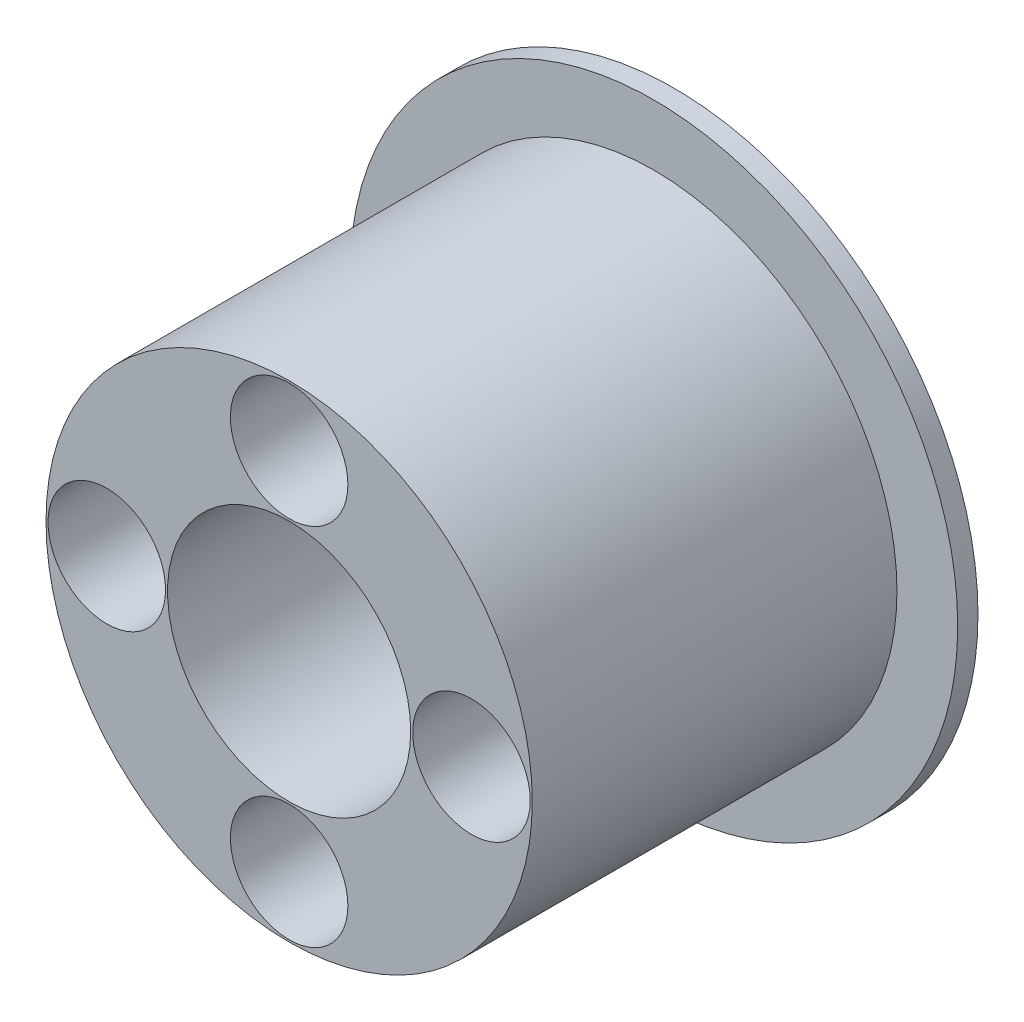
ISO-10303-21;
HEADER;
FILE_DESCRIPTION(('STEP AP214'),'2;1');
FILE_NAME('part.step','',(''),(''),'','','');
FILE_SCHEMA(('AUTOMOTIVE_DESIGN { 1 0 10303 214 1 1 1 1 }'));
ENDSEC;
DATA;
#1=APPLICATION_CONTEXT('core data for automotive mechanical design processes');
#2=APPLICATION_PROTOCOL_DEFINITION('international standard','automotive_design',2000,#1);
#3=PRODUCT_CONTEXT('',#1,'mechanical');
#4=PRODUCT('Part','Part','',(#3));
#5=PRODUCT_RELATED_PRODUCT_CATEGORY('part','',(#4));
#6=PRODUCT_DEFINITION_FORMATION('','',#4);
#7=PRODUCT_DEFINITION_CONTEXT('part definition',#1,'design');
#8=PRODUCT_DEFINITION('design','',#6,#7);
#9=PRODUCT_DEFINITION_SHAPE('','',#8);
#10=(LENGTH_UNIT() NAMED_UNIT(*) SI_UNIT(.MILLI.,.METRE.));
#11=(NAMED_UNIT(*) PLANE_ANGLE_UNIT() SI_UNIT($,.RADIAN.));
#12=(NAMED_UNIT(*) SI_UNIT($,.STERADIAN.) SOLID_ANGLE_UNIT());
#13=UNCERTAINTY_MEASURE_WITH_UNIT(LENGTH_MEASURE(1.E-05),#10,'distance_accuracy_value','');
#14=(GEOMETRIC_REPRESENTATION_CONTEXT(3) GLOBAL_UNCERTAINTY_ASSIGNED_CONTEXT((#13)) GLOBAL_UNIT_ASSIGNED_CONTEXT((#10,
#11,#12)) REPRESENTATION_CONTEXT('',''));
#15=CARTESIAN_POINT('',(0.,0.,0.));
#16=DIRECTION('',(0.,0.,1.));
#17=DIRECTION('',(1.,0.,0.));
#18=AXIS2_PLACEMENT_3D('',#15,#16,#17);
#19=CARTESIAN_POINT('',(0.,0.,18.));
#20=DIRECTION('',(0.,0.,1.));
#21=DIRECTION('',(1.,0.,0.));
#22=AXIS2_PLACEMENT_3D('',#19,#20,#21);
#23=PLANE('',#22);
#24=CARTESIAN_POINT('',(0.,0.,18.));
#25=DIRECTION('',(0.,0.,1.));
#26=DIRECTION('',(1.,0.,0.));
#27=AXIS2_PLACEMENT_3D('',#24,#25,#26);
#28=CIRCLE('',#27,6.);
#29=CARTESIAN_POINT('',(6.,0.,18.));
#30=VERTEX_POINT('',#29);
#31=EDGE_CURVE('E204',#30,#30,#28,.T.);
#32=ORIENTED_EDGE('',*,*,#31,.F.);
#33=EDGE_LOOP('',(#32));
#34=FACE_BOUND('',#33,.T.);
#35=CARTESIAN_POINT('',(0.,9.,18.));
#36=DIRECTION('',(0.,0.,1.));
#37=DIRECTION('',(1.,0.,0.));
#38=AXIS2_PLACEMENT_3D('',#35,#36,#37);
#39=CIRCLE('',#38,2.9);
#40=CARTESIAN_POINT('',(2.90000000000009,9.,18.));
#41=VERTEX_POINT('',#40);
#42=EDGE_CURVE('E181',#41,#41,#39,.T.);
#43=ORIENTED_EDGE('',*,*,#42,.F.);
#44=EDGE_LOOP('',(#43));
#45=FACE_BOUND('',#44,.T.);
#46=CARTESIAN_POINT('',(9.,-1.25693328198353E-13,18.));
#47=DIRECTION('',(0.,0.,1.));
#48=DIRECTION('',(1.,0.,0.));
#49=AXIS2_PLACEMENT_3D('',#46,#47,#48);
#50=CIRCLE('',#49,2.9);
#51=CARTESIAN_POINT('',(11.9,-1.25693328198353E-13,18.));
#52=VERTEX_POINT('',#51);
#53=EDGE_CURVE('E184',#52,#52,#50,.T.);
#54=ORIENTED_EDGE('',*,*,#53,.F.);
#55=EDGE_LOOP('',(#54));
#56=FACE_BOUND('',#55,.T.);
#57=CARTESIAN_POINT('',(-1.57116660247941E-13,-9.,18.));
#58=DIRECTION('',(0.,0.,1.));
#59=DIRECTION('',(1.,0.,0.));
#60=AXIS2_PLACEMENT_3D('',#57,#58,#59);
#61=CIRCLE('',#60,2.9);
#62=CARTESIAN_POINT('',(2.89999999999984,-9.,18.));
#63=VERTEX_POINT('',#62);
#64=EDGE_CURVE('E191',#63,#63,#61,.T.);
#65=ORIENTED_EDGE('',*,*,#64,.F.);
#66=EDGE_LOOP('',(#65));
#67=FACE_BOUND('',#66,.T.);
#68=CARTESIAN_POINT('',(-9.,1.90274715773506E-13,18.));
#69=DIRECTION('',(0.,0.,1.));
#70=DIRECTION('',(1.,0.,0.));
#71=AXIS2_PLACEMENT_3D('',#68,#69,#70);
#72=CIRCLE('',#71,2.9);
#73=CARTESIAN_POINT('',(-6.1,1.90274715773506E-13,18.));
#74=VERTEX_POINT('',#73);
#75=EDGE_CURVE('E107',#74,#74,#72,.T.);
#76=ORIENTED_EDGE('',*,*,#75,.F.);
#77=EDGE_LOOP('',(#76));
#78=FACE_BOUND('',#77,.T.);
#79=CARTESIAN_POINT('',(0.,0.,18.));
#80=DIRECTION('',(0.,0.,1.));
#81=DIRECTION('',(1.,0.,0.));
#82=AXIS2_PLACEMENT_3D('',#79,#80,#81);
#83=CIRCLE('',#82,12.);
#84=CARTESIAN_POINT('',(12.,0.,18.));
#85=VERTEX_POINT('',#84);
#86=EDGE_CURVE('E12',#85,#85,#83,.T.);
#87=ORIENTED_EDGE('',*,*,#86,.T.);
#88=EDGE_LOOP('',(#87));
#89=FACE_BOUND('',#88,.T.);
#90=ADVANCED_FACE('F65',(#34,#45,#56,#67,#78,#89),#23,.T.);
#91=CARTESIAN_POINT('',(0.,0.,-1.));
#92=DIRECTION('',(0.,0.,-1.));
#93=DIRECTION('',(-1.,0.,0.));
#94=AXIS2_PLACEMENT_3D('',#91,#92,#93);
#95=PLANE('',#94);
#96=CARTESIAN_POINT('',(0.,0.,-1.));
#97=DIRECTION('',(0.,0.,-1.));
#98=DIRECTION('',(-1.,0.,0.));
#99=AXIS2_PLACEMENT_3D('',#96,#97,#98);
#100=CIRCLE('',#99,6.);
#101=CARTESIAN_POINT('',(6.,0.,-1.));
#102=VERTEX_POINT('',#101);
#103=EDGE_CURVE('E69',#102,#102,#100,.T.);
#104=ORIENTED_EDGE('',*,*,#103,.F.);
#105=EDGE_LOOP('',(#104));
#106=FACE_BOUND('',#105,.T.);
#107=CARTESIAN_POINT('',(0.,-9.,-1.));
#108=DIRECTION('',(0.,0.,-1.));
#109=DIRECTION('',(-1.,0.,0.));
#110=AXIS2_PLACEMENT_3D('',#107,#108,#109);
#111=CIRCLE('',#110,1.5);
#112=CARTESIAN_POINT('',(-1.50000000000003,-9.,-1.));
#113=VERTEX_POINT('',#112);
#114=EDGE_CURVE('E99',#113,#113,#111,.T.);
#115=ORIENTED_EDGE('',*,*,#114,.F.);
#116=EDGE_LOOP('',(#115));
#117=FACE_BOUND('',#116,.T.);
#118=CARTESIAN_POINT('',(0.,9.,-1.));
#119=DIRECTION('',(0.,0.,-1.));
#120=DIRECTION('',(-1.,0.,0.));
#121=AXIS2_PLACEMENT_3D('',#118,#119,#120);
#122=CIRCLE('',#121,1.5);
#123=CARTESIAN_POINT('',(-1.4999999999999,9.,-1.));
#124=VERTEX_POINT('',#123);
#125=EDGE_CURVE('E112',#124,#124,#122,.T.);
#126=ORIENTED_EDGE('',*,*,#125,.F.);
#127=EDGE_LOOP('',(#126));
#128=FACE_BOUND('',#127,.T.);
#129=CARTESIAN_POINT('',(0.,0.,-1.));
#130=DIRECTION('',(0.,0.,-1.));
#131=DIRECTION('',(-1.,0.,0.));
#132=AXIS2_PLACEMENT_3D('',#129,#130,#131);
#133=CIRCLE('',#132,15.);
#134=CARTESIAN_POINT('',(-15.,0.,-1.));
#135=VERTEX_POINT('',#134);
#136=EDGE_CURVE('E78',#135,#135,#133,.T.);
#137=ORIENTED_EDGE('',*,*,#136,.T.);
#138=EDGE_LOOP('',(#137));
#139=FACE_BOUND('',#138,.T.);
#140=CARTESIAN_POINT('',(-9.,0.,-1.));
#141=DIRECTION('',(0.,0.,-1.));
#142=DIRECTION('',(-1.,0.,0.));
#143=AXIS2_PLACEMENT_3D('',#140,#141,#142);
#144=CIRCLE('',#143,1.5);
#145=CARTESIAN_POINT('',(-10.5,0.,-1.));
#146=VERTEX_POINT('',#145);
#147=EDGE_CURVE('E104',#146,#146,#144,.T.);
#148=ORIENTED_EDGE('',*,*,#147,.F.);
#149=EDGE_LOOP('',(#148));
#150=FACE_BOUND('',#149,.T.);
#151=CARTESIAN_POINT('',(9.,0.,-1.));
#152=DIRECTION('',(0.,0.,-1.));
#153=DIRECTION('',(-1.,0.,0.));
#154=AXIS2_PLACEMENT_3D('',#151,#152,#153);
#155=CIRCLE('',#154,1.5);
#156=CARTESIAN_POINT('',(7.5,0.,-1.));
#157=VERTEX_POINT('',#156);
#158=EDGE_CURVE('E95',#157,#157,#155,.T.);
#159=ORIENTED_EDGE('',*,*,#158,.F.);
#160=EDGE_LOOP('',(#159));
#161=FACE_BOUND('',#160,.T.);
#162=ADVANCED_FACE('F141',(#106,#117,#128,#139,#150,#161),#95,.T.);
#163=CARTESIAN_POINT('',(0.,0.,18.));
#164=DIRECTION('',(0.,0.,-1.));
#165=DIRECTION('',(-1.,0.,0.));
#166=AXIS2_PLACEMENT_3D('',#163,#164,#165);
#167=CYLINDRICAL_SURFACE('',#166,12.);
#168=ORIENTED_EDGE('',*,*,#86,.F.);
#169=EDGE_LOOP('',(#168));
#170=FACE_BOUND('',#169,.T.);
#171=CARTESIAN_POINT('',(0.,0.,0.));
#172=DIRECTION('',(0.,0.,1.));
#173=DIRECTION('',(1.,0.,0.));
#174=AXIS2_PLACEMENT_3D('',#171,#172,#173);
#175=CIRCLE('',#174,12.);
#176=CARTESIAN_POINT('',(12.,0.,0.));
#177=VERTEX_POINT('',#176);
#178=EDGE_CURVE('E73',#177,#177,#175,.T.);
#179=ORIENTED_EDGE('',*,*,#178,.T.);
#180=EDGE_LOOP('',(#179));
#181=FACE_BOUND('',#180,.T.);
#182=ADVANCED_FACE('F67',(#170,#181),#167,.T.);
#183=CARTESIAN_POINT('',(-9.,0.,18.));
#184=DIRECTION('',(0.,0.,-1.));
#185=DIRECTION('',(-1.,0.,0.));
#186=AXIS2_PLACEMENT_3D('',#183,#184,#185);
#187=CYLINDRICAL_SURFACE('',#186,1.5);
#188=CARTESIAN_POINT('',(-9.,0.,4.));
#189=DIRECTION('',(0.,0.,-1.));
#190=DIRECTION('',(-1.,0.,0.));
#191=AXIS2_PLACEMENT_3D('',#188,#189,#190);
#192=CIRCLE('',#191,1.5);
#193=CARTESIAN_POINT('',(-10.5,0.,4.));
#194=VERTEX_POINT('',#193);
#195=EDGE_CURVE('E93',#194,#194,#192,.T.);
#196=ORIENTED_EDGE('',*,*,#195,.F.);
#197=EDGE_LOOP('',(#196));
#198=FACE_BOUND('',#197,.T.);
#199=ORIENTED_EDGE('',*,*,#147,.T.);
#200=EDGE_LOOP('',(#199));
#201=FACE_BOUND('',#200,.T.);
#202=ADVANCED_FACE('F151',(#198,#201),#187,.F.);
#203=CARTESIAN_POINT('',(9.,0.,18.));
#204=DIRECTION('',(0.,0.,-1.));
#205=DIRECTION('',(-1.,0.,0.));
#206=AXIS2_PLACEMENT_3D('',#203,#204,#205);
#207=CYLINDRICAL_SURFACE('',#206,1.5);
#208=CARTESIAN_POINT('',(9.,0.,4.));
#209=DIRECTION('',(0.,0.,-1.));
#210=DIRECTION('',(-1.,0.,0.));
#211=AXIS2_PLACEMENT_3D('',#208,#209,#210);
#212=CIRCLE('',#211,1.5);
#213=CARTESIAN_POINT('',(7.5,0.,4.));
#214=VERTEX_POINT('',#213);
#215=EDGE_CURVE('E91',#214,#214,#212,.T.);
#216=ORIENTED_EDGE('',*,*,#215,.F.);
#217=EDGE_LOOP('',(#216));
#218=FACE_BOUND('',#217,.T.);
#219=ORIENTED_EDGE('',*,*,#158,.T.);
#220=EDGE_LOOP('',(#219));
#221=FACE_BOUND('',#220,.T.);
#222=ADVANCED_FACE('F154',(#218,#221),#207,.F.);
#223=CARTESIAN_POINT('',(0.,9.,18.));
#224=DIRECTION('',(0.,0.,-1.));
#225=DIRECTION('',(-1.,0.,0.));
#226=AXIS2_PLACEMENT_3D('',#223,#224,#225);
#227=CYLINDRICAL_SURFACE('',#226,1.5);
#228=CARTESIAN_POINT('',(0.,9.,4.));
#229=DIRECTION('',(0.,0.,-1.));
#230=DIRECTION('',(-1.,0.,0.));
#231=AXIS2_PLACEMENT_3D('',#228,#229,#230);
#232=CIRCLE('',#231,1.5);
#233=CARTESIAN_POINT('',(-1.4999999999999,9.,4.));
#234=VERTEX_POINT('',#233);
#235=EDGE_CURVE('E87',#234,#234,#232,.T.);
#236=ORIENTED_EDGE('',*,*,#235,.F.);
#237=EDGE_LOOP('',(#236));
#238=FACE_BOUND('',#237,.T.);
#239=ORIENTED_EDGE('',*,*,#125,.T.);
#240=EDGE_LOOP('',(#239));
#241=FACE_BOUND('',#240,.T.);
#242=ADVANCED_FACE('F135',(#238,#241),#227,.F.);
#243=CARTESIAN_POINT('',(0.,-9.,18.));
#244=DIRECTION('',(0.,0.,-1.));
#245=DIRECTION('',(-1.,0.,0.));
#246=AXIS2_PLACEMENT_3D('',#243,#244,#245);
#247=CYLINDRICAL_SURFACE('',#246,1.5);
#248=CARTESIAN_POINT('',(0.,-9.,4.));
#249=DIRECTION('',(0.,0.,-1.));
#250=DIRECTION('',(-1.,0.,0.));
#251=AXIS2_PLACEMENT_3D('',#248,#249,#250);
#252=CIRCLE('',#251,1.5);
#253=CARTESIAN_POINT('',(-1.50000000000003,-9.,4.));
#254=VERTEX_POINT('',#253);
#255=EDGE_CURVE('E84',#254,#254,#252,.T.);
#256=ORIENTED_EDGE('',*,*,#255,.F.);
#257=EDGE_LOOP('',(#256));
#258=FACE_BOUND('',#257,.T.);
#259=ORIENTED_EDGE('',*,*,#114,.T.);
#260=EDGE_LOOP('',(#259));
#261=FACE_BOUND('',#260,.T.);
#262=ADVANCED_FACE('F124',(#258,#261),#247,.F.);
#263=CARTESIAN_POINT('',(0.,0.,0.));
#264=DIRECTION('',(0.,0.,-1.));
#265=DIRECTION('',(-1.,0.,0.));
#266=AXIS2_PLACEMENT_3D('',#263,#264,#265);
#267=PLANE('',#266);
#268=ORIENTED_EDGE('',*,*,#178,.F.);
#269=EDGE_LOOP('',(#268));
#270=FACE_BOUND('',#269,.T.);
#271=CARTESIAN_POINT('',(0.,0.,0.));
#272=DIRECTION('',(0.,0.,-1.));
#273=DIRECTION('',(-1.,0.,0.));
#274=AXIS2_PLACEMENT_3D('',#271,#272,#273);
#275=CIRCLE('',#274,15.);
#276=CARTESIAN_POINT('',(-15.,0.,0.));
#277=VERTEX_POINT('',#276);
#278=EDGE_CURVE('E81',#277,#277,#275,.T.);
#279=ORIENTED_EDGE('',*,*,#278,.F.);
#280=EDGE_LOOP('',(#279));
#281=FACE_BOUND('',#280,.T.);
#282=ADVANCED_FACE('F122',(#270,#281),#267,.F.);
#283=CARTESIAN_POINT('',(0.,0.,-1.));
#284=DIRECTION('',(0.,0.,1.));
#285=DIRECTION('',(1.,0.,0.));
#286=AXIS2_PLACEMENT_3D('',#283,#284,#285);
#287=CYLINDRICAL_SURFACE('',#286,15.);
#288=ORIENTED_EDGE('',*,*,#136,.F.);
#289=EDGE_LOOP('',(#288));
#290=FACE_BOUND('',#289,.T.);
#291=ORIENTED_EDGE('',*,*,#278,.T.);
#292=EDGE_LOOP('',(#291));
#293=FACE_BOUND('',#292,.T.);
#294=ADVANCED_FACE('F120',(#290,#293),#287,.T.);
#295=CARTESIAN_POINT('',(0.,0.,4.));
#296=DIRECTION('',(0.,0.,-1.));
#297=DIRECTION('',(-1.,0.,0.));
#298=AXIS2_PLACEMENT_3D('',#295,#296,#297);
#299=PLANE('',#298);
#300=ORIENTED_EDGE('',*,*,#255,.T.);
#301=EDGE_LOOP('',(#300));
#302=FACE_BOUND('',#301,.T.);
#303=CARTESIAN_POINT('',(-1.57116660247941E-13,-9.,4.));
#304=DIRECTION('',(0.,0.,-1.));
#305=DIRECTION('',(-1.,0.,0.));
#306=AXIS2_PLACEMENT_3D('',#303,#304,#305);
#307=CIRCLE('',#306,2.9);
#308=CARTESIAN_POINT('',(-2.90000000000016,-9.,4.));
#309=VERTEX_POINT('',#308);
#310=EDGE_CURVE('E194',#309,#309,#307,.F.);
#311=ORIENTED_EDGE('',*,*,#310,.T.);
#312=EDGE_LOOP('',(#311));
#313=FACE_BOUND('',#312,.T.);
#314=ADVANCED_FACE('F131',(#302,#313),#299,.F.);
#315=CARTESIAN_POINT('',(-1.57116660247941E-13,-9.,-9.20243866176395));
#316=DIRECTION('',(0.,0.,1.));
#317=DIRECTION('',(1.,0.,0.));
#318=AXIS2_PLACEMENT_3D('',#315,#316,#317);
#319=CYLINDRICAL_SURFACE('',#318,2.9);
#320=ORIENTED_EDGE('',*,*,#64,.T.);
#321=EDGE_LOOP('',(#320));
#322=FACE_BOUND('',#321,.T.);
#323=ORIENTED_EDGE('',*,*,#310,.F.);
#324=EDGE_LOOP('',(#323));
#325=FACE_BOUND('',#324,.T.);
#326=ADVANCED_FACE('F176',(#322,#325),#319,.F.);
#327=CARTESIAN_POINT('',(0.,0.,4.));
#328=DIRECTION('',(0.,0.,-1.));
#329=DIRECTION('',(-1.,0.,0.));
#330=AXIS2_PLACEMENT_3D('',#327,#328,#329);
#331=PLANE('',#330);
#332=ORIENTED_EDGE('',*,*,#235,.T.);
#333=EDGE_LOOP('',(#332));
#334=FACE_BOUND('',#333,.T.);
#335=CARTESIAN_POINT('',(0.,9.,4.));
#336=DIRECTION('',(0.,0.,-1.));
#337=DIRECTION('',(-1.,0.,0.));
#338=AXIS2_PLACEMENT_3D('',#335,#336,#337);
#339=CIRCLE('',#338,2.9);
#340=CARTESIAN_POINT('',(-2.89999999999991,9.,4.));
#341=VERTEX_POINT('',#340);
#342=EDGE_CURVE('E88',#341,#341,#339,.F.);
#343=ORIENTED_EDGE('',*,*,#342,.T.);
#344=EDGE_LOOP('',(#343));
#345=FACE_BOUND('',#344,.T.);
#346=ADVANCED_FACE('F172',(#334,#345),#331,.F.);
#347=CARTESIAN_POINT('',(0.,9.,-9.20243866176395));
#348=DIRECTION('',(0.,0.,1.));
#349=DIRECTION('',(1.,0.,0.));
#350=AXIS2_PLACEMENT_3D('',#347,#348,#349);
#351=CYLINDRICAL_SURFACE('',#350,2.9);
#352=ORIENTED_EDGE('',*,*,#42,.T.);
#353=EDGE_LOOP('',(#352));
#354=FACE_BOUND('',#353,.T.);
#355=ORIENTED_EDGE('',*,*,#342,.F.);
#356=EDGE_LOOP('',(#355));
#357=FACE_BOUND('',#356,.T.);
#358=ADVANCED_FACE('F175',(#354,#357),#351,.F.);
#359=CARTESIAN_POINT('',(0.,0.,4.));
#360=DIRECTION('',(0.,0.,-1.));
#361=DIRECTION('',(-1.,0.,0.));
#362=AXIS2_PLACEMENT_3D('',#359,#360,#361);
#363=PLANE('',#362);
#364=ORIENTED_EDGE('',*,*,#215,.T.);
#365=EDGE_LOOP('',(#364));
#366=FACE_BOUND('',#365,.T.);
#367=CARTESIAN_POINT('',(9.,-1.25693328198353E-13,4.));
#368=DIRECTION('',(0.,0.,-1.));
#369=DIRECTION('',(-1.,0.,0.));
#370=AXIS2_PLACEMENT_3D('',#367,#368,#369);
#371=CIRCLE('',#370,2.9);
#372=CARTESIAN_POINT('',(6.1,-1.25693328198353E-13,4.));
#373=VERTEX_POINT('',#372);
#374=EDGE_CURVE('E188',#373,#373,#371,.F.);
#375=ORIENTED_EDGE('',*,*,#374,.T.);
#376=EDGE_LOOP('',(#375));
#377=FACE_BOUND('',#376,.T.);
#378=ADVANCED_FACE('F220',(#366,#377),#363,.F.);
#379=CARTESIAN_POINT('',(9.,-1.25693328198353E-13,-9.20243866176395));
#380=DIRECTION('',(0.,0.,1.));
#381=DIRECTION('',(1.,0.,0.));
#382=AXIS2_PLACEMENT_3D('',#379,#380,#381);
#383=CYLINDRICAL_SURFACE('',#382,2.9);
#384=ORIENTED_EDGE('',*,*,#53,.T.);
#385=EDGE_LOOP('',(#384));
#386=FACE_BOUND('',#385,.T.);
#387=ORIENTED_EDGE('',*,*,#374,.F.);
#388=EDGE_LOOP('',(#387));
#389=FACE_BOUND('',#388,.T.);
#390=ADVANCED_FACE('F225',(#386,#389),#383,.F.);
#391=CARTESIAN_POINT('',(0.,0.,4.));
#392=DIRECTION('',(0.,0.,-1.));
#393=DIRECTION('',(-1.,0.,0.));
#394=AXIS2_PLACEMENT_3D('',#391,#392,#393);
#395=PLANE('',#394);
#396=ORIENTED_EDGE('',*,*,#195,.T.);
#397=EDGE_LOOP('',(#396));
#398=FACE_BOUND('',#397,.T.);
#399=CARTESIAN_POINT('',(-9.,1.90274715773506E-13,4.));
#400=DIRECTION('',(0.,0.,-1.));
#401=DIRECTION('',(-1.,0.,0.));
#402=AXIS2_PLACEMENT_3D('',#399,#400,#401);
#403=CIRCLE('',#402,2.9);
#404=CARTESIAN_POINT('',(-11.9,1.90274715773506E-13,4.));
#405=VERTEX_POINT('',#404);
#406=EDGE_CURVE('E198',#405,#405,#403,.F.);
#407=ORIENTED_EDGE('',*,*,#406,.T.);
#408=EDGE_LOOP('',(#407));
#409=FACE_BOUND('',#408,.T.);
#410=ADVANCED_FACE('F215',(#398,#409),#395,.F.);
#411=CARTESIAN_POINT('',(-9.,1.90274715773506E-13,-9.20243866176395));
#412=DIRECTION('',(0.,0.,1.));
#413=DIRECTION('',(1.,0.,0.));
#414=AXIS2_PLACEMENT_3D('',#411,#412,#413);
#415=CYLINDRICAL_SURFACE('',#414,2.9);
#416=ORIENTED_EDGE('',*,*,#75,.T.);
#417=EDGE_LOOP('',(#416));
#418=FACE_BOUND('',#417,.T.);
#419=ORIENTED_EDGE('',*,*,#406,.F.);
#420=EDGE_LOOP('',(#419));
#421=FACE_BOUND('',#420,.T.);
#422=ADVANCED_FACE('F211',(#418,#421),#415,.F.);
#423=CARTESIAN_POINT('',(0.,0.,-2.00000000000001));
#424=DIRECTION('',(0.,0.,1.));
#425=DIRECTION('',(1.,0.,0.));
#426=AXIS2_PLACEMENT_3D('',#423,#424,#425);
#427=CYLINDRICAL_SURFACE('',#426,6.);
#428=CARTESIAN_POINT('',(6.,0.,-1.));
#429=CARTESIAN_POINT('',(6.,0.,-0.802083333333333));
#430=CARTESIAN_POINT('',(6.,0.,-0.604166666666666));
#431=CARTESIAN_POINT('',(6.,0.,-0.208333333333333));
#432=CARTESIAN_POINT('',(6.,0.,-0.0104166666666665));
#433=CARTESIAN_POINT('',(6.,0.,0.385416666666667));
#434=CARTESIAN_POINT('',(6.,0.,0.583333333333334));
#435=CARTESIAN_POINT('',(6.,0.,0.979166666666667));
#436=CARTESIAN_POINT('',(6.,0.,1.17708333333333));
#437=CARTESIAN_POINT('',(6.,0.,1.57291666666667));
#438=CARTESIAN_POINT('',(6.,0.,1.77083333333333));
#439=CARTESIAN_POINT('',(6.,0.,2.16666666666667));
#440=CARTESIAN_POINT('',(6.,0.,2.36458333333333));
#441=CARTESIAN_POINT('',(6.,0.,2.76041666666667));
#442=CARTESIAN_POINT('',(6.,0.,2.95833333333333));
#443=CARTESIAN_POINT('',(6.,0.,3.35416666666667));
#444=CARTESIAN_POINT('',(6.,0.,3.55208333333333));
#445=CARTESIAN_POINT('',(6.,0.,3.94791666666667));
#446=CARTESIAN_POINT('',(6.,0.,4.14583333333333));
#447=CARTESIAN_POINT('',(6.,0.,4.54166666666667));
#448=CARTESIAN_POINT('',(6.,0.,4.73958333333333));
#449=CARTESIAN_POINT('',(6.,0.,5.13541666666667));
#450=CARTESIAN_POINT('',(6.,0.,5.33333333333333));
#451=CARTESIAN_POINT('',(6.,0.,5.72916666666667));
#452=CARTESIAN_POINT('',(6.,0.,5.92708333333333));
#453=CARTESIAN_POINT('',(6.,0.,6.32291666666667));
#454=CARTESIAN_POINT('',(6.,0.,6.52083333333333));
#455=CARTESIAN_POINT('',(6.,0.,6.91666666666667));
#456=CARTESIAN_POINT('',(6.,0.,7.11458333333333));
#457=CARTESIAN_POINT('',(6.,0.,7.51041666666667));
#458=CARTESIAN_POINT('',(6.,0.,7.70833333333333));
#459=CARTESIAN_POINT('',(6.,0.,8.10416666666667));
#460=CARTESIAN_POINT('',(6.,0.,8.30208333333333));
#461=CARTESIAN_POINT('',(6.,0.,8.69791666666667));
#462=CARTESIAN_POINT('',(6.,0.,8.89583333333333));
#463=CARTESIAN_POINT('',(6.,0.,9.29166666666667));
#464=CARTESIAN_POINT('',(6.,0.,9.48958333333333));
#465=CARTESIAN_POINT('',(6.,0.,9.88541666666667));
#466=CARTESIAN_POINT('',(6.,0.,10.0833333333333));
#467=CARTESIAN_POINT('',(6.,0.,10.4791666666667));
#468=CARTESIAN_POINT('',(6.,0.,10.6770833333333));
#469=CARTESIAN_POINT('',(6.,0.,11.0729166666667));
#470=CARTESIAN_POINT('',(6.,0.,11.2708333333333));
#471=CARTESIAN_POINT('',(6.,0.,11.6666666666667));
#472=CARTESIAN_POINT('',(6.,0.,11.8645833333333));
#473=CARTESIAN_POINT('',(6.,0.,12.2604166666667));
#474=CARTESIAN_POINT('',(6.,0.,12.4583333333333));
#475=CARTESIAN_POINT('',(6.,0.,12.8541666666667));
#476=CARTESIAN_POINT('',(6.,0.,13.0520833333333));
#477=CARTESIAN_POINT('',(6.,0.,13.4479166666667));
#478=CARTESIAN_POINT('',(6.,0.,13.6458333333333));
#479=CARTESIAN_POINT('',(6.,0.,14.0416666666667));
#480=CARTESIAN_POINT('',(6.,0.,14.2395833333333));
#481=CARTESIAN_POINT('',(6.,0.,14.6354166666667));
#482=CARTESIAN_POINT('',(6.,0.,14.8333333333333));
#483=CARTESIAN_POINT('',(6.,0.,15.2291666666667));
#484=CARTESIAN_POINT('',(6.,0.,15.4270833333333));
#485=CARTESIAN_POINT('',(6.,0.,15.8229166666667));
#486=CARTESIAN_POINT('',(6.,0.,16.0208333333333));
#487=CARTESIAN_POINT('',(6.,0.,16.4166666666667));
#488=CARTESIAN_POINT('',(6.,0.,16.6145833333333));
#489=CARTESIAN_POINT('',(6.,0.,17.0104166666667));
#490=CARTESIAN_POINT('',(6.,0.,17.2083333333333));
#491=CARTESIAN_POINT('',(6.,0.,17.6041666666667));
#492=CARTESIAN_POINT('',(6.,0.,17.8020833333333));
#493=CARTESIAN_POINT('',(6.,0.,18.));
#494=B_SPLINE_CURVE_WITH_KNOTS('',3,(#428,#429,#430,#431,#432,#433,#434,#435,#436,#437,#438,
#439,#440,#441,#442,#443,#444,#445,#446,#447,#448,#449,#450,#451,#452,#453,#454,#455,#456,#457,
#458,#459,#460,#461,#462,#463,#464,#465,#466,#467,#468,#469,#470,#471,#472,#473,#474,#475,#476,
#477,#478,#479,#480,#481,#482,#483,#484,#485,#486,#487,#488,#489,#490,#491,#492,#493),
.UNSPECIFIED.,.F.,.F.,(4,2,2,2,2,2,2,2,2,2,2,2,2,2,2,2,2,2,2,2,2,2,2,2,2,2,2,2,2,2,2,2,4),(0.,
0.59375,1.1875,1.78125,2.375,2.96875,3.5625,4.15625,4.75,5.34375,5.9375,6.53125,7.125,7.71875,
8.3125,8.90625,9.5,10.09375,10.6875,11.28125,11.875,12.46875,13.0625,13.65625,14.25,14.84375,
15.4375,16.03125,16.625,17.21875,17.8125,18.40625,19.),.UNSPECIFIED.);
#495=EDGE_CURVE('BSEAM209',#102,#30,#494,.T.);
#496=ORIENTED_EDGE('',*,*,#103,.T.);
#497=ORIENTED_EDGE('',*,*,#31,.T.);
#498=ORIENTED_EDGE('',*,*,#495,.T.);
#499=ORIENTED_EDGE('',*,*,#495,.F.);
#500=EDGE_LOOP('',(#496,#498,#497,#499));
#501=FACE_BOUND('',#500,.T.);
#502=ADVANCED_FACE('F209',(#501),#427,.F.);
#503=CLOSED_SHELL('',(#90,#162,#182,#202,#222,#242,#262,#282,#294,#314,#326,#346,#358,#378,#390,
#410,#422,#502));
#504=MANIFOLD_SOLID_BREP('B2',#503);
#505=ADVANCED_BREP_SHAPE_REPRESENTATION('',(#18,#504),#14);
#506=SHAPE_DEFINITION_REPRESENTATION(#9,#505);
ENDSEC;
END-ISO-10303-21;
